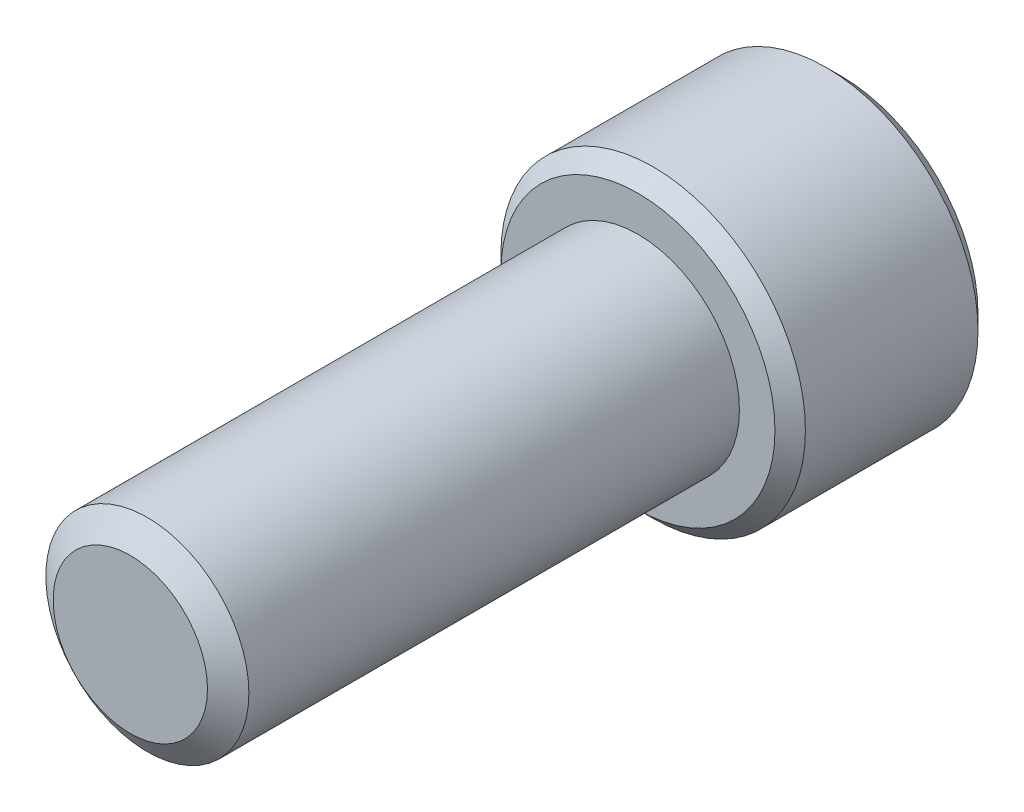
ISO-10303-21;
HEADER;
FILE_DESCRIPTION(('STEP AP214'),'2;1');
FILE_NAME('part.step','',(''),(''),'','','');
FILE_SCHEMA(('AUTOMOTIVE_DESIGN { 1 0 10303 214 1 1 1 1 }'));
ENDSEC;
DATA;
#1=APPLICATION_CONTEXT('core data for automotive mechanical design processes');
#2=APPLICATION_PROTOCOL_DEFINITION('international standard','automotive_design',2000,#1);
#3=PRODUCT_CONTEXT('',#1,'mechanical');
#4=PRODUCT('Part','Part','',(#3));
#5=PRODUCT_RELATED_PRODUCT_CATEGORY('part','',(#4));
#6=PRODUCT_DEFINITION_FORMATION('','',#4);
#7=PRODUCT_DEFINITION_CONTEXT('part definition',#1,'design');
#8=PRODUCT_DEFINITION('design','',#6,#7);
#9=PRODUCT_DEFINITION_SHAPE('','',#8);
#10=(LENGTH_UNIT() NAMED_UNIT(*) SI_UNIT(.MILLI.,.METRE.));
#11=(NAMED_UNIT(*) PLANE_ANGLE_UNIT() SI_UNIT($,.RADIAN.));
#12=(NAMED_UNIT(*) SI_UNIT($,.STERADIAN.) SOLID_ANGLE_UNIT());
#13=UNCERTAINTY_MEASURE_WITH_UNIT(LENGTH_MEASURE(1.E-05),#10,'distance_accuracy_value','');
#14=(GEOMETRIC_REPRESENTATION_CONTEXT(3) GLOBAL_UNCERTAINTY_ASSIGNED_CONTEXT((#13)) GLOBAL_UNIT_ASSIGNED_CONTEXT((#10,
#11,#12)) REPRESENTATION_CONTEXT('',''));
#15=CARTESIAN_POINT('',(0.,0.,0.));
#16=DIRECTION('',(0.,0.,1.));
#17=DIRECTION('',(1.,0.,0.));
#18=AXIS2_PLACEMENT_3D('',#15,#16,#17);
#19=CARTESIAN_POINT('',(0.,0.,-31.75));
#20=DIRECTION('',(0.,0.,1.));
#21=DIRECTION('',(1.,0.,0.));
#22=AXIS2_PLACEMENT_3D('',#19,#20,#21);
#23=CYLINDRICAL_SURFACE('',#22,6.35);
#24=CARTESIAN_POINT('',(0.,0.,-31.75));
#25=DIRECTION('',(0.,0.,-1.));
#26=DIRECTION('',(-1.,0.,0.));
#27=AXIS2_PLACEMENT_3D('',#24,#25,#26);
#28=CIRCLE('',#27,6.35);
#29=CARTESIAN_POINT('',(-6.35,0.,-31.75));
#30=VERTEX_POINT('',#29);
#31=EDGE_CURVE('E211',#30,#30,#28,.F.);
#32=ORIENTED_EDGE('',*,*,#31,.T.);
#33=EDGE_LOOP('',(#32));
#34=FACE_BOUND('',#33,.T.);
#35=CARTESIAN_POINT('',(0.,0.,-1.06645830547519));
#36=DIRECTION('',(0.,0.,1.));
#37=DIRECTION('',(1.,0.,0.));
#38=AXIS2_PLACEMENT_3D('',#35,#36,#37);
#39=CIRCLE('',#38,6.35);
#40=CARTESIAN_POINT('',(6.35,0.,-1.06645830547519));
#41=VERTEX_POINT('',#40);
#42=EDGE_CURVE('E108',#41,#41,#39,.T.);
#43=ORIENTED_EDGE('',*,*,#42,.F.);
#44=EDGE_LOOP('',(#43));
#45=FACE_BOUND('',#44,.T.);
#46=ADVANCED_FACE('F34',(#34,#45),#23,.T.);
#47=CARTESIAN_POINT('',(0.,0.,0.));
#48=DIRECTION('',(0.,0.,-1.));
#49=DIRECTION('',(-1.,0.,0.));
#50=AXIS2_PLACEMENT_3D('',#47,#48,#49);
#51=CONICAL_SURFACE('',#50,4.82693969676203,0.959931088596884);
#52=ORIENTED_EDGE('',*,*,#42,.T.);
#53=EDGE_LOOP('',(#52));
#54=FACE_BOUND('',#53,.T.);
#55=CARTESIAN_POINT('',(0.,0.,0.));
#56=DIRECTION('',(0.,0.,1.));
#57=DIRECTION('',(1.,0.,0.));
#58=AXIS2_PLACEMENT_3D('',#55,#56,#57);
#59=CIRCLE('',#58,4.82693969676203);
#60=CARTESIAN_POINT('',(4.82693969676203,0.,0.));
#61=VERTEX_POINT('',#60);
#62=EDGE_CURVE('E209',#61,#61,#59,.T.);
#63=ORIENTED_EDGE('',*,*,#62,.F.);
#64=EDGE_LOOP('',(#63));
#65=FACE_BOUND('',#64,.T.);
#66=ADVANCED_FACE('F192',(#54,#65),#51,.T.);
#67=CARTESIAN_POINT('',(0.,0.,0.));
#68=DIRECTION('',(0.,0.,1.));
#69=DIRECTION('',(1.,0.,0.));
#70=AXIS2_PLACEMENT_3D('',#67,#68,#69);
#71=PLANE('',#70);
#72=ORIENTED_EDGE('',*,*,#62,.T.);
#73=EDGE_LOOP('',(#72));
#74=FACE_BOUND('',#73,.T.);
#75=ADVANCED_FACE('F189',(#74),#71,.T.);
#76=CARTESIAN_POINT('',(0.,0.,-44.45));
#77=DIRECTION('',(0.,0.,1.));
#78=DIRECTION('',(1.,0.,0.));
#79=AXIS2_PLACEMENT_3D('',#76,#77,#78);
#80=CYLINDRICAL_SURFACE('',#79,9.525);
#81=CARTESIAN_POINT('',(0.,0.,-43.4975));
#82=DIRECTION('',(0.,0.,-1.));
#83=DIRECTION('',(-1.,0.,0.));
#84=AXIS2_PLACEMENT_3D('',#81,#82,#83);
#85=CIRCLE('',#84,9.525);
#86=CARTESIAN_POINT('',(9.525,0.,-43.4975));
#87=VERTEX_POINT('',#86);
#88=EDGE_CURVE('E42',#87,#87,#85,.F.);
#89=CARTESIAN_POINT('',(0.,0.,-32.7025));
#90=DIRECTION('',(0.,0.,-1.));
#91=DIRECTION('',(-1.,0.,0.));
#92=AXIS2_PLACEMENT_3D('',#89,#90,#91);
#93=CIRCLE('',#92,9.525);
#94=CARTESIAN_POINT('',(9.525,0.,-32.7025));
#95=VERTEX_POINT('',#94);
#96=EDGE_CURVE('E168',#95,#95,#93,.T.);
#97=CARTESIAN_POINT('',(9.525,0.,-43.4975));
#98=CARTESIAN_POINT('',(9.525,0.,-43.3850520833333));
#99=CARTESIAN_POINT('',(9.525,0.,-43.2726041666667));
#100=CARTESIAN_POINT('',(9.525,0.,-43.0477083333333));
#101=CARTESIAN_POINT('',(9.525,0.,-42.9352604166667));
#102=CARTESIAN_POINT('',(9.525,0.,-42.7103645833333));
#103=CARTESIAN_POINT('',(9.525,0.,-42.5979166666667));
#104=CARTESIAN_POINT('',(9.525,0.,-42.3730208333333));
#105=CARTESIAN_POINT('',(9.525,0.,-42.2605729166667));
#106=CARTESIAN_POINT('',(9.525,0.,-42.0356770833333));
#107=CARTESIAN_POINT('',(9.525,0.,-41.9232291666667));
#108=CARTESIAN_POINT('',(9.525,0.,-41.6983333333333));
#109=CARTESIAN_POINT('',(9.525,0.,-41.5858854166667));
#110=CARTESIAN_POINT('',(9.525,0.,-41.3609895833333));
#111=CARTESIAN_POINT('',(9.525,0.,-41.2485416666667));
#112=CARTESIAN_POINT('',(9.525,0.,-41.0236458333333));
#113=CARTESIAN_POINT('',(9.525,0.,-40.9111979166667));
#114=CARTESIAN_POINT('',(9.525,0.,-40.6863020833333));
#115=CARTESIAN_POINT('',(9.525,0.,-40.5738541666667));
#116=CARTESIAN_POINT('',(9.525,0.,-40.3489583333333));
#117=CARTESIAN_POINT('',(9.525,0.,-40.2365104166667));
#118=CARTESIAN_POINT('',(9.525,0.,-40.0116145833333));
#119=CARTESIAN_POINT('',(9.525,0.,-39.8991666666667));
#120=CARTESIAN_POINT('',(9.525,0.,-39.6742708333333));
#121=CARTESIAN_POINT('',(9.525,0.,-39.5618229166667));
#122=CARTESIAN_POINT('',(9.525,0.,-39.3369270833333));
#123=CARTESIAN_POINT('',(9.525,0.,-39.2244791666667));
#124=CARTESIAN_POINT('',(9.525,0.,-38.9995833333333));
#125=CARTESIAN_POINT('',(9.525,0.,-38.8871354166667));
#126=CARTESIAN_POINT('',(9.525,0.,-38.6622395833333));
#127=CARTESIAN_POINT('',(9.525,0.,-38.5497916666667));
#128=CARTESIAN_POINT('',(9.525,0.,-38.3248958333333));
#129=CARTESIAN_POINT('',(9.525,0.,-38.2124479166667));
#130=CARTESIAN_POINT('',(9.525,0.,-37.9875520833333));
#131=CARTESIAN_POINT('',(9.525,0.,-37.8751041666667));
#132=CARTESIAN_POINT('',(9.525,0.,-37.6502083333333));
#133=CARTESIAN_POINT('',(9.525,0.,-37.5377604166667));
#134=CARTESIAN_POINT('',(9.525,0.,-37.3128645833333));
#135=CARTESIAN_POINT('',(9.525,0.,-37.2004166666667));
#136=CARTESIAN_POINT('',(9.525,0.,-36.9755208333333));
#137=CARTESIAN_POINT('',(9.525,0.,-36.8630729166667));
#138=CARTESIAN_POINT('',(9.525,0.,-36.6381770833333));
#139=CARTESIAN_POINT('',(9.525,0.,-36.5257291666667));
#140=CARTESIAN_POINT('',(9.525,0.,-36.3008333333333));
#141=CARTESIAN_POINT('',(9.525,0.,-36.1883854166667));
#142=CARTESIAN_POINT('',(9.525,0.,-35.9634895833333));
#143=CARTESIAN_POINT('',(9.525,0.,-35.8510416666667));
#144=CARTESIAN_POINT('',(9.525,0.,-35.6261458333333));
#145=CARTESIAN_POINT('',(9.525,0.,-35.5136979166667));
#146=CARTESIAN_POINT('',(9.525,0.,-35.2888020833333));
#147=CARTESIAN_POINT('',(9.525,0.,-35.1763541666667));
#148=CARTESIAN_POINT('',(9.525,0.,-34.9514583333333));
#149=CARTESIAN_POINT('',(9.525,0.,-34.8390104166667));
#150=CARTESIAN_POINT('',(9.525,0.,-34.6141145833333));
#151=CARTESIAN_POINT('',(9.525,0.,-34.5016666666667));
#152=CARTESIAN_POINT('',(9.525,0.,-34.2767708333333));
#153=CARTESIAN_POINT('',(9.525,0.,-34.1643229166667));
#154=CARTESIAN_POINT('',(9.525,0.,-33.9394270833333));
#155=CARTESIAN_POINT('',(9.525,0.,-33.8269791666667));
#156=CARTESIAN_POINT('',(9.525,0.,-33.6020833333333));
#157=CARTESIAN_POINT('',(9.525,0.,-33.4896354166667));
#158=CARTESIAN_POINT('',(9.525,0.,-33.2647395833333));
#159=CARTESIAN_POINT('',(9.525,0.,-33.1522916666667));
#160=CARTESIAN_POINT('',(9.525,0.,-32.9273958333333));
#161=CARTESIAN_POINT('',(9.525,0.,-32.8149479166667));
#162=CARTESIAN_POINT('',(9.525,0.,-32.7025));
#163=B_SPLINE_CURVE_WITH_KNOTS('',3,(#97,#98,#99,#100,#101,#102,#103,#104,#105,#106,#107,#108,
#109,#110,#111,#112,#113,#114,#115,#116,#117,#118,#119,#120,#121,#122,#123,#124,#125,#126,#127,
#128,#129,#130,#131,#132,#133,#134,#135,#136,#137,#138,#139,#140,#141,#142,#143,#144,#145,#146,
#147,#148,#149,#150,#151,#152,#153,#154,#155,#156,#157,#158,#159,#160,#161,#162),.UNSPECIFIED.,
.F.,.F.,(4,2,2,2,2,2,2,2,2,2,2,2,2,2,2,2,2,2,2,2,2,2,2,2,2,2,2,2,2,2,2,2,4),(0.,
0.337343749999997,0.674687499999993,1.01203125,1.349375,1.68671875,2.02406249999999,2.36140625,
2.69875,3.03609375,3.37343749999999,3.71078125,4.048125,4.38546875,4.72281249999999,5.06015625,
5.3975,5.73484375,6.07218749999999,6.40953125,6.746875,7.08421875,7.42156249999999,7.75890625,
8.09625,8.43359375,8.77093749999999,9.10828125,9.445625,9.78296874999999,10.1203125,10.45765625,
10.795),.UNSPECIFIED.);
#164=EDGE_CURVE('BSEAM173',#87,#95,#163,.T.);
#165=ORIENTED_EDGE('',*,*,#88,.T.);
#166=ORIENTED_EDGE('',*,*,#96,.T.);
#167=ORIENTED_EDGE('',*,*,#164,.T.);
#168=ORIENTED_EDGE('',*,*,#164,.F.);
#169=EDGE_LOOP('',(#165,#167,#166,#168));
#170=FACE_BOUND('',#169,.T.);
#171=ADVANCED_FACE('F173',(#170),#80,.T.);
#172=CARTESIAN_POINT('',(0.,0.,-44.45));
#173=DIRECTION('',(0.,0.,-1.));
#174=DIRECTION('',(-1.,0.,0.));
#175=AXIS2_PLACEMENT_3D('',#172,#173,#174);
#176=PLANE('',#175);
#177=CARTESIAN_POINT('',(0.,0.,-44.45));
#178=DIRECTION('',(0.,0.,-1.));
#179=DIRECTION('',(-1.,0.,0.));
#180=AXIS2_PLACEMENT_3D('',#177,#178,#179);
#181=CIRCLE('',#180,8.5725);
#182=CARTESIAN_POINT('',(8.57250000000001,0.,-44.45));
#183=VERTEX_POINT('',#182);
#184=EDGE_CURVE('E107',#183,#183,#181,.T.);
#185=ORIENTED_EDGE('',*,*,#184,.T.);
#186=EDGE_LOOP('',(#185));
#187=FACE_BOUND('',#186,.T.);
#188=CARTESIAN_POINT('',(0.,0.,-44.45));
#189=DIRECTION('',(0.,0.,-1.));
#190=DIRECTION('',(-1.,0.,0.));
#191=AXIS2_PLACEMENT_3D('',#188,#189,#190);
#192=CIRCLE('',#191,5.49926131403118);
#193=CARTESIAN_POINT('',(-4.7625,2.74963065701559,-44.45));
#194=VERTEX_POINT('',#193);
#195=CARTESIAN_POINT('',(0.,5.49926131403119,-44.45));
#196=VERTEX_POINT('',#195);
#197=EDGE_CURVE('E88',#194,#196,#192,.T.);
#198=ORIENTED_EDGE('',*,*,#197,.F.);
#199=CARTESIAN_POINT('',(-4.7625,-2.74963065701559,-44.45));
#200=VERTEX_POINT('',#199);
#201=EDGE_CURVE('E48',#200,#194,#192,.T.);
#202=ORIENTED_EDGE('',*,*,#201,.F.);
#203=CARTESIAN_POINT('',(0.,-5.49926131403119,-44.45));
#204=VERTEX_POINT('',#203);
#205=EDGE_CURVE('E267',#204,#200,#192,.T.);
#206=ORIENTED_EDGE('',*,*,#205,.F.);
#207=CARTESIAN_POINT('',(4.7625,-2.74963065701559,-44.45));
#208=VERTEX_POINT('',#207);
#209=EDGE_CURVE('E55',#208,#204,#192,.T.);
#210=ORIENTED_EDGE('',*,*,#209,.F.);
#211=CARTESIAN_POINT('',(4.7625,2.7496306570156,-44.45));
#212=VERTEX_POINT('',#211);
#213=EDGE_CURVE('E129',#212,#208,#192,.T.);
#214=ORIENTED_EDGE('',*,*,#213,.F.);
#215=EDGE_CURVE('E97',#196,#212,#192,.T.);
#216=ORIENTED_EDGE('',*,*,#215,.F.);
#217=EDGE_LOOP('',(#198,#202,#206,#210,#214,#216));
#218=FACE_BOUND('',#217,.T.);
#219=ADVANCED_FACE('F128',(#187,#218),#176,.T.);
#220=CARTESIAN_POINT('',(0.,0.,-31.75));
#221=DIRECTION('',(0.,0.,-1.));
#222=DIRECTION('',(-1.,0.,0.));
#223=AXIS2_PLACEMENT_3D('',#220,#221,#222);
#224=PLANE('',#223);
#225=CARTESIAN_POINT('',(0.,0.,-31.75));
#226=DIRECTION('',(0.,0.,-1.));
#227=DIRECTION('',(-1.,0.,0.));
#228=AXIS2_PLACEMENT_3D('',#225,#226,#227);
#229=CIRCLE('',#228,8.5725);
#230=CARTESIAN_POINT('',(-8.5725,0.,-31.75));
#231=VERTEX_POINT('',#230);
#232=EDGE_CURVE('E11',#231,#231,#229,.F.);
#233=ORIENTED_EDGE('',*,*,#232,.T.);
#234=EDGE_LOOP('',(#233));
#235=FACE_BOUND('',#234,.T.);
#236=ORIENTED_EDGE('',*,*,#31,.F.);
#237=EDGE_LOOP('',(#236));
#238=FACE_BOUND('',#237,.T.);
#239=ADVANCED_FACE('F182',(#235,#238),#224,.F.);
#240=CARTESIAN_POINT('',(0.,0.,-44.45));
#241=DIRECTION('',(0.,0.,-1.));
#242=DIRECTION('',(-1.,0.,0.));
#243=AXIS2_PLACEMENT_3D('',#240,#241,#242);
#244=CONICAL_SURFACE('',#243,5.49926131403118,0.78539816339745);
#245=ORIENTED_EDGE('',*,*,#215,.T.);
#246=CARTESIAN_POINT('',(-0.000200000000000345,5.49937678408502,-44.4501154736906));
#247=CARTESIAN_POINT('',(0.0816893480838661,5.45209794692504,-44.4028407556525));
#248=CARTESIAN_POINT('',(0.164208143319191,5.40445569828272,-44.3570168014971));
#249=CARTESIAN_POINT('',(0.330628122507659,5.30837307849973,-44.2687117475931));
#250=CARTESIAN_POINT('',(0.414530031662503,5.25993228866365,-44.2262324736266));
#251=CARTESIAN_POINT('',(0.669275181013717,5.11285510811098,-44.1041113956322));
#252=CARTESIAN_POINT('',(0.842275000393996,5.01297361582202,-44.0303073349844));
#253=CARTESIAN_POINT('',(1.1911430001273,4.81155458226435,-43.9039228471471));
#254=CARTESIAN_POINT('',(1.36692200675387,4.71006852547062,-43.8510240046038));
#255=CARTESIAN_POINT('',(1.63348047384544,4.55617092274053,-43.7898329527378));
#256=CARTESIAN_POINT('',(1.722725751811,4.5046451374832,-43.7724703211731));
#257=CARTESIAN_POINT('',(1.90197198308188,4.40115727760774,-43.744190373215));
#258=CARTESIAN_POINT('',(1.99197282140491,4.34919526937464,-43.7332720935183));
#259=CARTESIAN_POINT('',(2.21129017337659,4.22257233717584,-43.714966175378));
#260=CARTESIAN_POINT('',(2.34084298819892,4.14777498466389,-43.7111250872346));
#261=CARTESIAN_POINT('',(2.59971514322133,3.998315076276,-43.71757107705));
#262=CARTESIAN_POINT('',(2.7290343856686,3.92365257683768,-43.7278631075927));
#263=CARTESIAN_POINT('',(2.98645369702303,3.77503146813259,-43.7619686587254));
#264=CARTESIAN_POINT('',(3.11455223924902,3.70107374029561,-43.7857973014266));
#265=CARTESIAN_POINT('',(3.36854763194612,3.55442943194902,-43.8456805959169));
#266=CARTESIAN_POINT('',(3.49444465045488,3.48174275442281,-43.881734310271));
#267=CARTESIAN_POINT('',(3.71793882917551,3.35270833017614,-43.9559094233337));
#268=CARTESIAN_POINT('',(3.8160307872892,3.29607491175387,-43.9920803606544));
#269=CARTESIAN_POINT('',(4.01045375934658,3.18382475649989,-44.0702513094624));
#270=CARTESIAN_POINT('',(4.10678471969659,3.12820805061052,-44.1122514980222));
#271=CARTESIAN_POINT('',(4.29738229488755,3.01816648926713,-44.2011393953942));
#272=CARTESIAN_POINT('',(4.39165433052154,2.96373850411679,-44.2480117345331));
#273=CARTESIAN_POINT('',(4.57845266367266,2.85589043618782,-44.3460284938486));
#274=CARTESIAN_POINT('',(4.67097998993277,2.80246975946415,-44.397170293478));
#275=CARTESIAN_POINT('',(4.7627,2.74951518696176,-44.4501154736906));
#276=B_SPLINE_CURVE_WITH_KNOTS('',3,(#246,#247,#248,#249,#250,#251,#252,#253,#254,#255,#256,
#257,#258,#259,#260,#261,#262,#263,#264,#265,#266,#267,#268,#269,#270,#271,#272,#273,#274,#275),
.UNSPECIFIED.,.F.,.F.,(4,2,2,2,2,2,2,2,2,2,2,2,2,2,4),(0.,0.317131998246114,0.63443592816495,
1.27246967840819,1.90037160310751,2.21370673072325,2.52699500906332,2.97522950661222,
3.42362111637256,3.87251462420204,4.32137371805213,4.67791268795819,5.03446249066165,
5.38991982411499,5.7451605637036),.UNSPECIFIED.);
#277=EDGE_CURVE('E102',#196,#212,#276,.T.);
#278=ORIENTED_EDGE('',*,*,#277,.F.);
#279=EDGE_LOOP('',(#245,#278));
#280=FACE_BOUND('',#279,.T.);
#281=ADVANCED_FACE('F103',(#280),#244,.F.);
#282=ORIENTED_EDGE('',*,*,#213,.T.);
#283=CARTESIAN_POINT('',(4.7625,-5.48388581178774,-46.2139617891598));
#284=CARTESIAN_POINT('',(4.7625,-5.35035922109852,-46.1131693359319));
#285=CARTESIAN_POINT('',(4.7625,-5.21608502224391,-46.0133511751692));
#286=CARTESIAN_POINT('',(4.7625,-4.94574650111728,-45.8160996619835));
#287=CARTESIAN_POINT('',(4.7625,-4.80968173792853,-45.718666914514));
#288=CARTESIAN_POINT('',(4.7625,-4.53447187008637,-45.5259297088824));
#289=CARTESIAN_POINT('',(4.7625,-4.39531106684215,-45.4306475907792));
#290=CARTESIAN_POINT('',(4.7625,-4.1146273569229,-45.2436398468593));
#291=CARTESIAN_POINT('',(4.7625,-3.97310461814435,-45.151913969777));
#292=CARTESIAN_POINT('',(4.7625,-3.67915365943653,-44.9676909372029));
#293=CARTESIAN_POINT('',(4.7625,-3.52656445385329,-44.8754493500526));
#294=CARTESIAN_POINT('',(4.7625,-3.21782430493592,-44.6970350361653));
#295=CARTESIAN_POINT('',(4.7625,-3.06167280246542,-44.6108632709426));
#296=CARTESIAN_POINT('',(4.7625,-2.74582258478881,-44.4464478893172));
#297=CARTESIAN_POINT('',(4.7625,-2.58613610080726,-44.3681809601197));
#298=CARTESIAN_POINT('',(4.7625,-2.26240805689586,-44.2213273547376));
#299=CARTESIAN_POINT('',(4.7625,-2.09836850912671,-44.1527362954894));
#300=CARTESIAN_POINT('',(4.7625,-1.77907051581844,-44.0327092630561));
#301=CARTESIAN_POINT('',(4.7625,-1.62416773376041,-43.9803369574484));
#302=CARTESIAN_POINT('',(4.7625,-1.31063273083529,-43.8880195023893));
#303=CARTESIAN_POINT('',(4.7625,-1.15200025385341,-43.848075209055));
#304=CARTESIAN_POINT('',(4.7625,-0.834591529608672,-43.7833642925721));
#305=CARTESIAN_POINT('',(4.7625,-0.675869177242026,-43.7583376243693));
#306=CARTESIAN_POINT('',(4.7625,-0.356727682468881,-43.7239477126733));
#307=CARTESIAN_POINT('',(4.7625,-0.196308836510142,-43.7145817766674));
#308=CARTESIAN_POINT('',(4.7625,0.118837522614849,-43.7122089092024));
#309=CARTESIAN_POINT('',(4.7625,0.273560867955293,-43.7186221219989));
#310=CARTESIAN_POINT('',(4.7625,0.581682230341388,-43.7461740124862));
#311=CARTESIAN_POINT('',(4.7625,0.735080117171964,-43.767314120686));
#312=CARTESIAN_POINT('',(4.7625,1.04203381322605,-43.8235260427747));
#313=CARTESIAN_POINT('',(4.7625,1.19554550604675,-43.8588349389728));
#314=CARTESIAN_POINT('',(4.7625,1.49922403888639,-43.9415013514975));
#315=CARTESIAN_POINT('',(4.7625,1.64939115763907,-43.98885785967));
#316=CARTESIAN_POINT('',(4.7625,1.95997972064102,-44.0985417757163));
#317=CARTESIAN_POINT('',(4.7625,2.1200498294441,-44.161854037463));
#318=CARTESIAN_POINT('',(4.7625,2.43603219749264,-44.2981984477104));
#319=CARTESIAN_POINT('',(4.7625,2.59194247896613,-44.3712351241623));
#320=CARTESIAN_POINT('',(4.7625,2.90036713506396,-44.5252906655538));
#321=CARTESIAN_POINT('',(4.7625,3.05286888920128,-44.6063345937996));
#322=CARTESIAN_POINT('',(4.7625,3.3543629348118,-44.7746133515017));
#323=CARTESIAN_POINT('',(4.7625,3.50335577943939,-44.8618471963426));
#324=CARTESIAN_POINT('',(4.7625,3.79095963433685,-45.0368226733915));
#325=CARTESIAN_POINT('',(4.7625,3.92971827501105,-45.1243229288265));
#326=CARTESIAN_POINT('',(4.7625,4.20485340546187,-45.3030029741682));
#327=CARTESIAN_POINT('',(4.7625,4.34122971367904,-45.3941830427787));
#328=CARTESIAN_POINT('',(4.7625,4.61080608732201,-45.5788118247346));
#329=CARTESIAN_POINT('',(4.7625,4.7440229549486,-45.6722360930792));
#330=CARTESIAN_POINT('',(4.7625,5.00863613054828,-45.8615552487242));
#331=CARTESIAN_POINT('',(4.7625,5.14003292909845,-45.9574494495425));
#332=CARTESIAN_POINT('',(4.7625,5.27066757711893,-46.054353467085));
#333=B_SPLINE_CURVE_WITH_KNOTS('',3,(#283,#284,#285,#286,#287,#288,#289,#290,#291,#292,#293,
#294,#295,#296,#297,#298,#299,#300,#301,#302,#303,#304,#305,#306,#307,#308,#309,#310,#311,#312,
#313,#314,#315,#316,#317,#318,#319,#320,#321,#322,#323,#324,#325,#326,#327,#328,#329,#330,#331,
#332),.UNSPECIFIED.,.F.,.F.,(4,2,2,2,2,2,2,2,2,2,2,2,2,2,2,2,2,2,2,2,2,2,2,2,4),(0.,
0.501902568019972,1.00393112965577,1.50984955194718,2.01573216329084,2.55052903608619,
3.08541043586616,3.61866524806543,4.15167772057686,4.64179705613575,5.13195014661719,
5.61328801048044,6.09454311055177,6.55837882375549,7.02225959830171,7.49424955247613,
7.96620002312871,8.48220672640918,8.99845454218858,9.51637278206305,10.0342088217976,
10.5262709591158,11.018370434702,11.5064725267514,11.994440391368),.UNSPECIFIED.);
#334=EDGE_CURVE('E96',#212,#208,#333,.F.);
#335=ORIENTED_EDGE('',*,*,#334,.F.);
#336=EDGE_LOOP('',(#282,#335));
#337=FACE_BOUND('',#336,.T.);
#338=ADVANCED_FACE('F273',(#337),#244,.F.);
#339=ORIENTED_EDGE('',*,*,#209,.T.);
#340=CARTESIAN_POINT('',(4.7627,-2.74951518696176,-44.4501154736906));
#341=CARTESIAN_POINT('',(4.68081065191613,-2.79679402412174,-44.4028407556525));
#342=CARTESIAN_POINT('',(4.59829185668081,-2.84443627276406,-44.3570168014971));
#343=CARTESIAN_POINT('',(4.43187187749234,-2.94051889254705,-44.2687117475931));
#344=CARTESIAN_POINT('',(4.3479699683375,-2.98895968238312,-44.2262324736266));
#345=CARTESIAN_POINT('',(4.09322481898628,-3.1360368629358,-44.1041113956322));
#346=CARTESIAN_POINT('',(3.920224999606,-3.23591835522476,-44.0303073349843));
#347=CARTESIAN_POINT('',(3.5713569998727,-3.43733738878243,-43.9039228471471));
#348=CARTESIAN_POINT('',(3.39557799324613,-3.53882344557616,-43.8510240046038));
#349=CARTESIAN_POINT('',(3.12901952615456,-3.69272104830625,-43.7898329527378));
#350=CARTESIAN_POINT('',(3.039774248189,-3.74424683356358,-43.7724703211731));
#351=CARTESIAN_POINT('',(2.86052801691812,-3.84773469343904,-43.744190373215));
#352=CARTESIAN_POINT('',(2.77052717859509,-3.89969670167213,-43.7332720935183));
#353=CARTESIAN_POINT('',(2.55120982662341,-4.02631963387094,-43.714966175378));
#354=CARTESIAN_POINT('',(2.42165701180108,-4.10111698638289,-43.7111250872346));
#355=CARTESIAN_POINT('',(2.16278485677867,-4.25057689477078,-43.71757107705));
#356=CARTESIAN_POINT('',(2.0334656143314,-4.3252393942091,-43.7278631075927));
#357=CARTESIAN_POINT('',(1.77604630297697,-4.47386050291419,-43.7619686587254));
#358=CARTESIAN_POINT('',(1.64794776075098,-4.54781823075117,-43.7857973014266));
#359=CARTESIAN_POINT('',(1.39395236805388,-4.69446253909776,-43.8456805959169));
#360=CARTESIAN_POINT('',(1.26805534954512,-4.76714921662397,-43.881734310271));
#361=CARTESIAN_POINT('',(1.04456117082449,-4.89618364087063,-43.9559094233337));
#362=CARTESIAN_POINT('',(0.946469212710801,-4.95281705929291,-43.9920803606544));
#363=CARTESIAN_POINT('',(0.75204624065342,-5.06506721454689,-44.0702513094624));
#364=CARTESIAN_POINT('',(0.655715280303414,-5.12068392043626,-44.1122514980222));
#365=CARTESIAN_POINT('',(0.465117705112458,-5.23072548177965,-44.2011393953942));
#366=CARTESIAN_POINT('',(0.370845669478464,-5.28515346692999,-44.2480117345331));
#367=CARTESIAN_POINT('',(0.184047336327343,-5.39300153485896,-44.3460284938486));
#368=CARTESIAN_POINT('',(0.0915200100672353,-5.44642221158263,-44.397170293478));
#369=CARTESIAN_POINT('',(-0.000200000000000106,-5.49937678408502,-44.4501154736906));
#370=B_SPLINE_CURVE_WITH_KNOTS('',3,(#340,#341,#342,#343,#344,#345,#346,#347,#348,#349,#350,
#351,#352,#353,#354,#355,#356,#357,#358,#359,#360,#361,#362,#363,#364,#365,#366,#367,#368,#369),
.UNSPECIFIED.,.F.,.F.,(4,2,2,2,2,2,2,2,2,2,2,2,2,2,4),(0.,0.317131998246114,0.63443592816495,
1.27246967840819,1.90037160310751,2.21370673072325,2.52699500906332,2.97522950661222,
3.42362111637256,3.87251462420204,4.32137371805213,4.67791268795819,5.03446249066165,
5.38991982411499,5.7451605637036),.UNSPECIFIED.);
#371=EDGE_CURVE('E138',#208,#204,#370,.T.);
#372=ORIENTED_EDGE('',*,*,#371,.F.);
#373=EDGE_LOOP('',(#339,#372));
#374=FACE_BOUND('',#373,.T.);
#375=ADVANCED_FACE('F270',(#374),#244,.F.);
#376=ORIENTED_EDGE('',*,*,#205,.T.);
#377=CARTESIAN_POINT('',(0.000200000000001687,-5.49937678408502,-44.4501154736906));
#378=CARTESIAN_POINT('',(-0.0816893480838646,-5.45209794692504,-44.4028407556525));
#379=CARTESIAN_POINT('',(-0.16420814331919,-5.40445569828272,-44.3570168014971));
#380=CARTESIAN_POINT('',(-0.330628122507658,-5.30837307849973,-44.2687117475931));
#381=CARTESIAN_POINT('',(-0.414530031662502,-5.25993228866365,-44.2262324736266));
#382=CARTESIAN_POINT('',(-0.669275181013716,-5.11285510811098,-44.1041113956322));
#383=CARTESIAN_POINT('',(-0.842275000393996,-5.01297361582202,-44.0303073349844));
#384=CARTESIAN_POINT('',(-1.1911430001273,-4.81155458226435,-43.9039228471471));
#385=CARTESIAN_POINT('',(-1.36692200675387,-4.71006852547061,-43.8510240046038));
#386=CARTESIAN_POINT('',(-1.63348047384544,-4.55617092274052,-43.7898329527378));
#387=CARTESIAN_POINT('',(-1.722725751811,-4.5046451374832,-43.7724703211731));
#388=CARTESIAN_POINT('',(-1.90197198308188,-4.40115727760774,-43.744190373215));
#389=CARTESIAN_POINT('',(-1.99197282140491,-4.34919526937464,-43.7332720935183));
#390=CARTESIAN_POINT('',(-2.21129017337659,-4.22257233717584,-43.714966175378));
#391=CARTESIAN_POINT('',(-2.34084298819893,-4.14777498466389,-43.7111250872346));
#392=CARTESIAN_POINT('',(-2.59971514322134,-3.998315076276,-43.71757107705));
#393=CARTESIAN_POINT('',(-2.7290343856686,-3.92365257683767,-43.7278631075927));
#394=CARTESIAN_POINT('',(-2.98645369702303,-3.77503146813259,-43.7619686587254));
#395=CARTESIAN_POINT('',(-3.11455223924902,-3.70107374029561,-43.7857973014266));
#396=CARTESIAN_POINT('',(-3.36854763194612,-3.55442943194901,-43.8456805959169));
#397=CARTESIAN_POINT('',(-3.49444465045489,-3.48174275442281,-43.881734310271));
#398=CARTESIAN_POINT('',(-3.71793882917551,-3.35270833017614,-43.9559094233337));
#399=CARTESIAN_POINT('',(-3.8160307872892,-3.29607491175387,-43.9920803606544));
#400=CARTESIAN_POINT('',(-4.01045375934658,-3.18382475649989,-44.0702513094624));
#401=CARTESIAN_POINT('',(-4.10678471969659,-3.12820805061052,-44.1122514980222));
#402=CARTESIAN_POINT('',(-4.29738229488755,-3.01816648926713,-44.2011393953942));
#403=CARTESIAN_POINT('',(-4.39165433052154,-2.96373850411679,-44.2480117345331));
#404=CARTESIAN_POINT('',(-4.57845266367266,-2.85589043618782,-44.3460284938486));
#405=CARTESIAN_POINT('',(-4.67097998993277,-2.80246975946415,-44.397170293478));
#406=CARTESIAN_POINT('',(-4.7627,-2.74951518696175,-44.4501154736906));
#407=B_SPLINE_CURVE_WITH_KNOTS('',3,(#377,#378,#379,#380,#381,#382,#383,#384,#385,#386,#387,
#388,#389,#390,#391,#392,#393,#394,#395,#396,#397,#398,#399,#400,#401,#402,#403,#404,#405,#406),
.UNSPECIFIED.,.F.,.F.,(4,2,2,2,2,2,2,2,2,2,2,2,2,2,4),(0.,0.317131998246114,0.634435928164951,
1.27246967840819,1.90037160310751,2.21370673072325,2.52699500906333,2.97522950661223,
3.42362111637257,3.87251462420205,4.32137371805213,4.67791268795819,5.03446249066166,
5.38991982411499,5.7451605637036),.UNSPECIFIED.);
#408=EDGE_CURVE('E245',#204,#200,#407,.T.);
#409=ORIENTED_EDGE('',*,*,#408,.F.);
#410=EDGE_LOOP('',(#376,#409));
#411=FACE_BOUND('',#410,.T.);
#412=ADVANCED_FACE('F269',(#411),#244,.F.);
#413=ORIENTED_EDGE('',*,*,#201,.T.);
#414=CARTESIAN_POINT('',(-4.7625,-5.48388581258561,-46.2139617897622));
#415=CARTESIAN_POINT('',(-4.7625,-5.35035922187402,-46.1131693365111));
#416=CARTESIAN_POINT('',(-4.7625,-5.21608502299695,-46.0133511757253));
#417=CARTESIAN_POINT('',(-4.7625,-4.94574650182517,-45.8160996624934));
#418=CARTESIAN_POINT('',(-4.7625,-4.80968173861374,-45.7186669150008));
#419=CARTESIAN_POINT('',(-4.7625,-4.53447187072545,-45.525929709323));
#420=CARTESIAN_POINT('',(-4.7625,-4.39531106745777,-45.4306475911966));
#421=CARTESIAN_POINT('',(-4.7625,-4.11462735749119,-45.2436398472307));
#422=CARTESIAN_POINT('',(-4.7625,-3.97310461868876,-45.1519139701256));
#423=CARTESIAN_POINT('',(-4.7625,-3.67915365992945,-44.967690937504));
#424=CARTESIAN_POINT('',(-4.7625,-3.52656445431853,-44.8754493503292));
#425=CARTESIAN_POINT('',(-4.7625,-3.2178243053448,-44.6970350363939));
#426=CARTESIAN_POINT('',(-4.7625,-3.06167280284561,-44.6108632711477));
#427=CARTESIAN_POINT('',(-4.7625,-2.74582258511061,-44.4464478894775));
#428=CARTESIAN_POINT('',(-4.7625,-2.58613610109936,-44.3681809602585));
#429=CARTESIAN_POINT('',(-4.7625,-2.26240805712696,-44.2213273548362));
#430=CARTESIAN_POINT('',(-4.7625,-2.09836850932652,-44.1527362955692));
#431=CARTESIAN_POINT('',(-4.7625,-1.77907051600474,-44.0327092631219));
#432=CARTESIAN_POINT('',(-4.7625,-1.62416773396585,-43.9803369575153));
#433=CARTESIAN_POINT('',(-4.7625,-1.31063273107964,-43.8880195024548));
#434=CARTESIAN_POINT('',(-4.7625,-1.15200025411753,-43.8480752091178));
#435=CARTESIAN_POINT('',(-4.7625,-0.834591529911674,-43.7833642926251));
#436=CARTESIAN_POINT('',(-4.7625,-0.675869177564134,-43.7583376244153));
#437=CARTESIAN_POINT('',(-4.7625,-0.356727682828562,-43.7239477127008));
#438=CARTESIAN_POINT('',(-4.7625,-0.196308836888289,-43.7145817766835));
#439=CARTESIAN_POINT('',(-4.7625,0.118837522202628,-43.7122089091926));
#440=CARTESIAN_POINT('',(-4.7625,0.273560867527419,-43.7186221219748));
#441=CARTESIAN_POINT('',(-4.7625,0.581682229883773,-43.7461740124311));
#442=CARTESIAN_POINT('',(-4.7625,0.735080116700263,-43.7673141206143));
#443=CARTESIAN_POINT('',(-4.7625,1.04203381272654,-43.8235260426682));
#444=CARTESIAN_POINT('',(-4.7625,1.19554550553356,-43.858834938848));
#445=CARTESIAN_POINT('',(-4.7625,1.49922403834716,-43.9415013513357));
#446=CARTESIAN_POINT('',(-4.7625,1.64939115708748,-43.9888578594896));
#447=CARTESIAN_POINT('',(-4.7625,1.95997972002342,-44.0985417754825));
#448=CARTESIAN_POINT('',(-4.7625,2.12004982877402,-44.1618540371914));
#449=CARTESIAN_POINT('',(-4.7625,2.43603219672028,-44.2981984473595));
#450=CARTESIAN_POINT('',(-4.7625,2.59194247814397,-44.37123512377));
#451=CARTESIAN_POINT('',(-4.7625,2.900367134144,-44.5252906650759));
#452=CARTESIAN_POINT('',(-4.7625,3.05286888823332,-44.6063345932777));
#453=CARTESIAN_POINT('',(-4.7625,3.3543629337494,-44.7746133508903));
#454=CARTESIAN_POINT('',(-4.7625,3.50335577833056,-44.8618471956859));
#455=CARTESIAN_POINT('',(-4.7625,3.79095963314362,-45.0368226726486));
#456=CARTESIAN_POINT('',(-4.7625,3.92971827377971,-45.1243229280429));
#457=CARTESIAN_POINT('',(-4.7625,4.20485340415483,-45.3030029733033));
#458=CARTESIAN_POINT('',(-4.7625,4.34122971233443,-45.394183041873));
#459=CARTESIAN_POINT('',(-4.7625,4.61080608590315,-45.5788118237478));
#460=CARTESIAN_POINT('',(-4.7625,4.74402295349307,-45.6722360920521));
#461=CARTESIAN_POINT('',(-4.7625,5.00863612901964,-45.8615552476165));
#462=CARTESIAN_POINT('',(-4.7625,5.14003292753338,-45.9574494483944));
#463=CARTESIAN_POINT('',(-4.7625,5.27066757551748,-46.0543534658968));
#464=B_SPLINE_CURVE_WITH_KNOTS('',3,(#414,#415,#416,#417,#418,#419,#420,#421,#422,#423,#424,
#425,#426,#427,#428,#429,#430,#431,#432,#433,#434,#435,#436,#437,#438,#439,#440,#441,#442,#443,
#444,#445,#446,#447,#448,#449,#450,#451,#452,#453,#454,#455,#456,#457,#458,#459,#460,#461,#462,
#463),.UNSPECIFIED.,.F.,.F.,(4,2,2,2,2,2,2,2,2,2,2,2,2,2,2,2,2,2,2,2,2,2,2,2,4),(0.,
0.501902568115502,1.00393112984686,1.50984955223563,2.01573216367663,2.55052903658114,
3.08541043647034,3.61866524877791,4.15167772139747,4.64179705690101,5.1319501473272,
5.61328801113744,6.09454311115577,6.55837882431099,7.02225959880865,7.4942495529308,
7.96620002353113,8.4822067266238,8.99845454221519,9.51637278190056,10.0342088214461,
10.5262709586026,11.0183704340271,11.506472525917,11.994440390374),.UNSPECIFIED.);
#465=EDGE_CURVE('E118',#200,#194,#464,.T.);
#466=ORIENTED_EDGE('',*,*,#465,.F.);
#467=EDGE_LOOP('',(#413,#466));
#468=FACE_BOUND('',#467,.T.);
#469=ADVANCED_FACE('F282',(#468),#244,.F.);
#470=ORIENTED_EDGE('',*,*,#197,.T.);
#471=CARTESIAN_POINT('',(-4.7627,2.74951518696176,-44.4501154736906));
#472=CARTESIAN_POINT('',(-4.68081065191613,2.79679402412174,-44.4028407556525));
#473=CARTESIAN_POINT('',(-4.59829185668081,2.84443627276406,-44.3570168014971));
#474=CARTESIAN_POINT('',(-4.43187187749234,2.94051889254705,-44.2687117475931));
#475=CARTESIAN_POINT('',(-4.34796996833749,2.98895968238312,-44.2262324736266));
#476=CARTESIAN_POINT('',(-4.09322481898628,3.1360368629358,-44.1041113956322));
#477=CARTESIAN_POINT('',(-3.920224999606,3.23591835522476,-44.0303073349844));
#478=CARTESIAN_POINT('',(-3.5713569998727,3.43733738878243,-43.9039228471471));
#479=CARTESIAN_POINT('',(-3.39557799324613,3.53882344557616,-43.8510240046038));
#480=CARTESIAN_POINT('',(-3.12901952615456,3.69272104830625,-43.7898329527378));
#481=CARTESIAN_POINT('',(-3.039774248189,3.74424683356358,-43.7724703211731));
#482=CARTESIAN_POINT('',(-2.86052801691812,3.84773469343904,-43.744190373215));
#483=CARTESIAN_POINT('',(-2.77052717859509,3.89969670167214,-43.7332720935183));
#484=CARTESIAN_POINT('',(-2.55120982662341,4.02631963387094,-43.714966175378));
#485=CARTESIAN_POINT('',(-2.42165701180107,4.10111698638289,-43.7111250872346));
#486=CARTESIAN_POINT('',(-2.16278485677866,4.25057689477078,-43.71757107705));
#487=CARTESIAN_POINT('',(-2.0334656143314,4.3252393942091,-43.7278631075927));
#488=CARTESIAN_POINT('',(-1.77604630297697,4.47386050291419,-43.7619686587254));
#489=CARTESIAN_POINT('',(-1.64794776075098,4.54781823075117,-43.7857973014266));
#490=CARTESIAN_POINT('',(-1.39395236805387,4.69446253909776,-43.8456805959169));
#491=CARTESIAN_POINT('',(-1.26805534954511,4.76714921662397,-43.881734310271));
#492=CARTESIAN_POINT('',(-1.04456117082449,4.89618364087064,-43.9559094233337));
#493=CARTESIAN_POINT('',(-0.946469212710797,4.95281705929291,-43.9920803606544));
#494=CARTESIAN_POINT('',(-0.752046240653417,5.06506721454689,-44.0702513094624));
#495=CARTESIAN_POINT('',(-0.655715280303412,5.12068392043626,-44.1122514980222));
#496=CARTESIAN_POINT('',(-0.465117705112455,5.23072548177965,-44.2011393953942));
#497=CARTESIAN_POINT('',(-0.370845669478461,5.28515346692999,-44.2480117345331));
#498=CARTESIAN_POINT('',(-0.184047336327339,5.39300153485896,-44.3460284938486));
#499=CARTESIAN_POINT('',(-0.0915200100672303,5.44642221158263,-44.397170293478));
#500=CARTESIAN_POINT('',(0.000200000000002468,5.49937678408502,-44.4501154736906));
#501=B_SPLINE_CURVE_WITH_KNOTS('',3,(#471,#472,#473,#474,#475,#476,#477,#478,#479,#480,#481,
#482,#483,#484,#485,#486,#487,#488,#489,#490,#491,#492,#493,#494,#495,#496,#497,#498,#499,#500),
.UNSPECIFIED.,.F.,.F.,(4,2,2,2,2,2,2,2,2,2,2,2,2,2,4),(0.,0.317131998246115,0.634435928164952,
1.27246967840819,1.90037160310751,2.21370673072325,2.52699500906333,2.97522950661223,
3.42362111637257,3.87251462420205,4.32137371805213,4.67791268795819,5.03446249066165,
5.38991982411499,5.7451605637036),.UNSPECIFIED.);
#502=EDGE_CURVE('E92',#194,#196,#501,.T.);
#503=ORIENTED_EDGE('',*,*,#502,.F.);
#504=EDGE_LOOP('',(#470,#503));
#505=FACE_BOUND('',#504,.T.);
#506=ADVANCED_FACE('F90',(#505),#244,.F.);
#507=CARTESIAN_POINT('',(4.7625,8.24889197104678,-37.30625));
#508=DIRECTION('',(0.,0.,-1.));
#509=DIRECTION('',(-1.,0.,0.));
#510=AXIS2_PLACEMENT_3D('',#507,#508,#509);
#511=PLANE('',#510);
#512=DIRECTION('',(0.866025403784439,0.5,0.));
#513=VECTOR('',#512,1.);
#514=CARTESIAN_POINT('',(-4.7625,2.74963065701559,-37.30625));
#515=LINE('',#514,#513);
#516=CARTESIAN_POINT('',(-4.7625,2.74963065701559,-37.30625));
#517=VERTEX_POINT('',#516);
#518=CARTESIAN_POINT('',(0.,5.49926131403118,-37.30625));
#519=VERTEX_POINT('',#518);
#520=EDGE_CURVE('E117',#517,#519,#515,.T.);
#521=ORIENTED_EDGE('',*,*,#520,.T.);
#522=DIRECTION('',(0.866025403784439,-0.5,0.));
#523=VECTOR('',#522,1.);
#524=CARTESIAN_POINT('',(0.,5.49926131403118,-37.30625));
#525=LINE('',#524,#523);
#526=CARTESIAN_POINT('',(4.7625,2.74963065701559,-37.30625));
#527=VERTEX_POINT('',#526);
#528=EDGE_CURVE('E122',#519,#527,#525,.T.);
#529=ORIENTED_EDGE('',*,*,#528,.T.);
#530=DIRECTION('',(0.,-1.,0.));
#531=VECTOR('',#530,1.);
#532=CARTESIAN_POINT('',(4.7625,2.74963065701559,-37.30625));
#533=LINE('',#532,#531);
#534=CARTESIAN_POINT('',(4.7625,-2.74963065701559,-37.30625));
#535=VERTEX_POINT('',#534);
#536=EDGE_CURVE('E233',#527,#535,#533,.T.);
#537=ORIENTED_EDGE('',*,*,#536,.T.);
#538=DIRECTION('',(-0.866025403784439,-0.5,0.));
#539=VECTOR('',#538,1.);
#540=CARTESIAN_POINT('',(4.7625,-2.74963065701559,-37.30625));
#541=LINE('',#540,#539);
#542=CARTESIAN_POINT('',(0.,-5.49926131403119,-37.30625));
#543=VERTEX_POINT('',#542);
#544=EDGE_CURVE('E230',#535,#543,#541,.T.);
#545=ORIENTED_EDGE('',*,*,#544,.T.);
#546=DIRECTION('',(-0.866025403784439,0.5,0.));
#547=VECTOR('',#546,1.);
#548=CARTESIAN_POINT('',(0.,-5.49926131403119,-37.30625));
#549=LINE('',#548,#547);
#550=CARTESIAN_POINT('',(-4.7625,-2.74963065701559,-37.30625));
#551=VERTEX_POINT('',#550);
#552=EDGE_CURVE('E227',#543,#551,#549,.T.);
#553=ORIENTED_EDGE('',*,*,#552,.T.);
#554=DIRECTION('',(0.,1.,0.));
#555=VECTOR('',#554,1.);
#556=CARTESIAN_POINT('',(-4.7625,-2.74963065701559,-37.30625));
#557=LINE('',#556,#555);
#558=EDGE_CURVE('E125',#551,#517,#557,.T.);
#559=ORIENTED_EDGE('',*,*,#558,.T.);
#560=EDGE_LOOP('',(#521,#529,#537,#545,#553,#559));
#561=FACE_BOUND('',#560,.T.);
#562=ADVANCED_FACE('F157',(#561),#511,.T.);
#563=CARTESIAN_POINT('',(0.,5.49926131403118,-37.30625));
#564=DIRECTION('',(0.5,0.866025403784439,0.));
#565=DIRECTION('',(-0.866025403784439,0.5,0.));
#566=AXIS2_PLACEMENT_3D('',#563,#564,#565);
#567=PLANE('',#566);
#568=DIRECTION('',(0.,0.,-1.));
#569=VECTOR('',#568,1.);
#570=CARTESIAN_POINT('',(0.,5.49926131403118,-37.30625));
#571=LINE('',#570,#569);
#572=EDGE_CURVE('E114',#519,#196,#571,.T.);
#573=ORIENTED_EDGE('',*,*,#572,.T.);
#574=ORIENTED_EDGE('',*,*,#277,.T.);
#575=DIRECTION('',(0.,0.,-1.));
#576=VECTOR('',#575,1.);
#577=CARTESIAN_POINT('',(4.7625,2.74963065701559,-37.30625));
#578=LINE('',#577,#576);
#579=EDGE_CURVE('E124',#527,#212,#578,.T.);
#580=ORIENTED_EDGE('',*,*,#579,.F.);
#581=ORIENTED_EDGE('',*,*,#528,.F.);
#582=EDGE_LOOP('',(#573,#574,#580,#581));
#583=FACE_BOUND('',#582,.T.);
#584=ADVANCED_FACE('F120',(#583),#567,.F.);
#585=CARTESIAN_POINT('',(4.7625,2.74963065701559,-37.30625));
#586=DIRECTION('',(1.,0.,0.));
#587=DIRECTION('',(0.,1.,0.));
#588=AXIS2_PLACEMENT_3D('',#585,#586,#587);
#589=PLANE('',#588);
#590=ORIENTED_EDGE('',*,*,#579,.T.);
#591=ORIENTED_EDGE('',*,*,#334,.T.);
#592=DIRECTION('',(0.,0.,-1.));
#593=VECTOR('',#592,1.);
#594=CARTESIAN_POINT('',(4.7625,-2.74963065701559,-37.30625));
#595=LINE('',#594,#593);
#596=EDGE_CURVE('E216',#535,#208,#595,.T.);
#597=ORIENTED_EDGE('',*,*,#596,.F.);
#598=ORIENTED_EDGE('',*,*,#536,.F.);
#599=EDGE_LOOP('',(#590,#591,#597,#598));
#600=FACE_BOUND('',#599,.T.);
#601=ADVANCED_FACE('F146',(#600),#589,.F.);
#602=CARTESIAN_POINT('',(4.7625,-2.74963065701559,-37.30625));
#603=DIRECTION('',(0.5,-0.866025403784439,0.));
#604=DIRECTION('',(0.866025403784439,0.5,0.));
#605=AXIS2_PLACEMENT_3D('',#602,#603,#604);
#606=PLANE('',#605);
#607=ORIENTED_EDGE('',*,*,#596,.T.);
#608=ORIENTED_EDGE('',*,*,#371,.T.);
#609=DIRECTION('',(0.,0.,-1.));
#610=VECTOR('',#609,1.);
#611=CARTESIAN_POINT('',(0.,-5.49926131403119,-37.30625));
#612=LINE('',#611,#610);
#613=EDGE_CURVE('E219',#543,#204,#612,.T.);
#614=ORIENTED_EDGE('',*,*,#613,.F.);
#615=ORIENTED_EDGE('',*,*,#544,.F.);
#616=EDGE_LOOP('',(#607,#608,#614,#615));
#617=FACE_BOUND('',#616,.T.);
#618=ADVANCED_FACE('F150',(#617),#606,.F.);
#619=CARTESIAN_POINT('',(0.,-5.49926131403119,-37.30625));
#620=DIRECTION('',(-0.5,-0.866025403784439,0.));
#621=DIRECTION('',(0.866025403784439,-0.5,0.));
#622=AXIS2_PLACEMENT_3D('',#619,#620,#621);
#623=PLANE('',#622);
#624=ORIENTED_EDGE('',*,*,#613,.T.);
#625=ORIENTED_EDGE('',*,*,#408,.T.);
#626=DIRECTION('',(0.,0.,-1.));
#627=VECTOR('',#626,1.);
#628=CARTESIAN_POINT('',(-4.7625,-2.74963065701559,-37.30625));
#629=LINE('',#628,#627);
#630=EDGE_CURVE('E222',#551,#200,#629,.T.);
#631=ORIENTED_EDGE('',*,*,#630,.F.);
#632=ORIENTED_EDGE('',*,*,#552,.F.);
#633=EDGE_LOOP('',(#624,#625,#631,#632));
#634=FACE_BOUND('',#633,.T.);
#635=ADVANCED_FACE('F252',(#634),#623,.F.);
#636=CARTESIAN_POINT('',(-4.7625,-2.74963065701559,-37.30625));
#637=DIRECTION('',(-1.,0.,0.));
#638=DIRECTION('',(0.,-1.,0.));
#639=AXIS2_PLACEMENT_3D('',#636,#637,#638);
#640=PLANE('',#639);
#641=ORIENTED_EDGE('',*,*,#630,.T.);
#642=ORIENTED_EDGE('',*,*,#465,.T.);
#643=DIRECTION('',(0.,0.,-1.));
#644=VECTOR('',#643,1.);
#645=CARTESIAN_POINT('',(-4.7625,2.74963065701559,-37.30625));
#646=LINE('',#645,#644);
#647=EDGE_CURVE('E116',#517,#194,#646,.T.);
#648=ORIENTED_EDGE('',*,*,#647,.F.);
#649=ORIENTED_EDGE('',*,*,#558,.F.);
#650=EDGE_LOOP('',(#641,#642,#648,#649));
#651=FACE_BOUND('',#650,.T.);
#652=ADVANCED_FACE('F249',(#651),#640,.F.);
#653=CARTESIAN_POINT('',(-4.7625,2.74963065701559,-37.30625));
#654=DIRECTION('',(-0.5,0.866025403784439,0.));
#655=DIRECTION('',(-0.866025403784439,-0.5,0.));
#656=AXIS2_PLACEMENT_3D('',#653,#654,#655);
#657=PLANE('',#656);
#658=ORIENTED_EDGE('',*,*,#647,.T.);
#659=ORIENTED_EDGE('',*,*,#502,.T.);
#660=ORIENTED_EDGE('',*,*,#572,.F.);
#661=ORIENTED_EDGE('',*,*,#520,.F.);
#662=EDGE_LOOP('',(#658,#659,#660,#661));
#663=FACE_BOUND('',#662,.T.);
#664=ADVANCED_FACE('F112',(#663),#657,.F.);
#665=CARTESIAN_POINT('',(0.,0.,-44.45));
#666=DIRECTION('',(0.,0.,1.));
#667=DIRECTION('',(1.,0.,0.));
#668=AXIS2_PLACEMENT_3D('',#665,#666,#667);
#669=CONICAL_SURFACE('',#668,8.5725,0.785398163397446);
#670=CARTESIAN_POINT('',(9.525,0.,-43.4975));
#671=CARTESIAN_POINT('',(9.515078125,0.,-43.507421875));
#672=CARTESIAN_POINT('',(9.50515625000001,0.,-43.51734375));
#673=CARTESIAN_POINT('',(9.4853125,0.,-43.5371875));
#674=CARTESIAN_POINT('',(9.475390625,0.,-43.547109375));
#675=CARTESIAN_POINT('',(9.455546875,0.,-43.566953125));
#676=CARTESIAN_POINT('',(9.44562500000001,0.,-43.576875));
#677=CARTESIAN_POINT('',(9.42578125000001,0.,-43.59671875));
#678=CARTESIAN_POINT('',(9.415859375,0.,-43.606640625));
#679=CARTESIAN_POINT('',(9.396015625,0.,-43.626484375));
#680=CARTESIAN_POINT('',(9.38609375,0.,-43.63640625));
#681=CARTESIAN_POINT('',(9.36625,0.,-43.65625));
#682=CARTESIAN_POINT('',(9.35632812500001,0.,-43.666171875));
#683=CARTESIAN_POINT('',(9.336484375,0.,-43.686015625));
#684=CARTESIAN_POINT('',(9.3265625,0.,-43.6959375));
#685=CARTESIAN_POINT('',(9.30671875,0.,-43.71578125));
#686=CARTESIAN_POINT('',(9.29679687500001,0.,-43.725703125));
#687=CARTESIAN_POINT('',(9.27695312500001,0.,-43.745546875));
#688=CARTESIAN_POINT('',(9.26703125,0.,-43.75546875));
#689=CARTESIAN_POINT('',(9.2471875,0.,-43.7753125));
#690=CARTESIAN_POINT('',(9.23726562500001,0.,-43.785234375));
#691=CARTESIAN_POINT('',(9.21742187500001,0.,-43.805078125));
#692=CARTESIAN_POINT('',(9.2075,0.,-43.815));
#693=CARTESIAN_POINT('',(9.18765625,0.,-43.83484375));
#694=CARTESIAN_POINT('',(9.17773437500001,0.,-43.844765625));
#695=CARTESIAN_POINT('',(9.15789062500001,0.,-43.864609375));
#696=CARTESIAN_POINT('',(9.14796875000001,0.,-43.87453125));
#697=CARTESIAN_POINT('',(9.12812500000001,0.,-43.894375));
#698=CARTESIAN_POINT('',(9.118203125,0.,-43.904296875));
#699=CARTESIAN_POINT('',(9.098359375,0.,-43.924140625));
#700=CARTESIAN_POINT('',(9.08843750000001,0.,-43.9340625));
#701=CARTESIAN_POINT('',(9.06859375000001,0.,-43.95390625));
#702=CARTESIAN_POINT('',(9.05867187500001,0.,-43.963828125));
#703=CARTESIAN_POINT('',(9.038828125,0.,-43.983671875));
#704=CARTESIAN_POINT('',(9.02890625000001,0.,-43.99359375));
#705=CARTESIAN_POINT('',(9.0090625,0.,-44.0134375));
#706=CARTESIAN_POINT('',(8.99914062500001,0.,-44.023359375));
#707=CARTESIAN_POINT('',(8.97929687500001,0.,-44.043203125));
#708=CARTESIAN_POINT('',(8.969375,0.,-44.053125));
#709=CARTESIAN_POINT('',(8.94953125000001,0.,-44.07296875));
#710=CARTESIAN_POINT('',(8.93960937500001,0.,-44.082890625));
#711=CARTESIAN_POINT('',(8.91976562500001,0.,-44.102734375));
#712=CARTESIAN_POINT('',(8.90984375000001,0.,-44.11265625));
#713=CARTESIAN_POINT('',(8.89000000000001,0.,-44.1325));
#714=CARTESIAN_POINT('',(8.880078125,0.,-44.142421875));
#715=CARTESIAN_POINT('',(8.860234375,0.,-44.162265625));
#716=CARTESIAN_POINT('',(8.85031250000001,0.,-44.1721875));
#717=CARTESIAN_POINT('',(8.83046875000001,0.,-44.19203125));
#718=CARTESIAN_POINT('',(8.82054687500001,0.,-44.201953125));
#719=CARTESIAN_POINT('',(8.80070312500001,0.,-44.221796875));
#720=CARTESIAN_POINT('',(8.79078125000001,0.,-44.23171875));
#721=CARTESIAN_POINT('',(8.77093750000001,0.,-44.2515625));
#722=CARTESIAN_POINT('',(8.76101562500001,0.,-44.261484375));
#723=CARTESIAN_POINT('',(8.74117187500001,0.,-44.281328125));
#724=CARTESIAN_POINT('',(8.73125000000001,0.,-44.29125));
#725=CARTESIAN_POINT('',(8.71140625000001,0.,-44.31109375));
#726=CARTESIAN_POINT('',(8.70148437500001,0.,-44.321015625));
#727=CARTESIAN_POINT('',(8.68164062500001,0.,-44.340859375));
#728=CARTESIAN_POINT('',(8.67171875000001,0.,-44.35078125));
#729=CARTESIAN_POINT('',(8.65187500000001,0.,-44.370625));
#730=CARTESIAN_POINT('',(8.64195312500001,0.,-44.380546875));
#731=CARTESIAN_POINT('',(8.62210937500001,0.,-44.400390625));
#732=CARTESIAN_POINT('',(8.61218750000001,0.,-44.4103125));
#733=CARTESIAN_POINT('',(8.59234375000001,0.,-44.43015625));
#734=CARTESIAN_POINT('',(8.58242187500001,0.,-44.440078125));
#735=CARTESIAN_POINT('',(8.57250000000001,0.,-44.45));
#736=B_SPLINE_CURVE_WITH_KNOTS('',3,(#670,#671,#672,#673,#674,#675,#676,#677,#678,#679,#680,
#681,#682,#683,#684,#685,#686,#687,#688,#689,#690,#691,#692,#693,#694,#695,#696,#697,#698,#699,
#700,#701,#702,#703,#704,#705,#706,#707,#708,#709,#710,#711,#712,#713,#714,#715,#716,#717,#718,
#719,#720,#721,#722,#723,#724,#725,#726,#727,#728,#729,#730,#731,#732,#733,#734,#735),
.UNSPECIFIED.,.F.,.F.,(4,2,2,2,2,2,2,2,2,2,2,2,2,2,2,2,2,2,2,2,2,2,2,2,2,2,2,2,2,2,2,2,4),(0.,
0.042094950567509,0.0841899011350192,0.126284851702534,0.168379802270043,0.210474752837558,
0.252569703405067,0.294664653972578,0.336759604540092,0.378854555107602,0.420949505675116,
0.463044456242626,0.505139406810135,0.54723435737765,0.589329307945159,0.631424258512674,
0.673519209080184,0.715614159647693,0.757709110215208,0.799804060782717,0.841899011350232,
0.883993961917741,0.926088912485251,0.968183863052765,1.01027881362028,1.05237376418779,
1.0944687147553,1.13656366532281,1.17865861589032,1.22075356645783,1.26284851702535,
1.30494346759286,1.34703841816037),.UNSPECIFIED.);
#737=EDGE_CURVE('BSEAM176',#87,#183,#736,.T.);
#738=ORIENTED_EDGE('',*,*,#88,.F.);
#739=ORIENTED_EDGE('',*,*,#184,.F.);
#740=ORIENTED_EDGE('',*,*,#737,.T.);
#741=ORIENTED_EDGE('',*,*,#737,.F.);
#742=EDGE_LOOP('',(#738,#740,#739,#741));
#743=FACE_BOUND('',#742,.T.);
#744=ADVANCED_FACE('F176',(#743),#669,.T.);
#745=CARTESIAN_POINT('',(0.,0.,-32.7025));
#746=DIRECTION('',(0.,0.,-1.));
#747=DIRECTION('',(-1.,0.,0.));
#748=AXIS2_PLACEMENT_3D('',#745,#746,#747);
#749=CONICAL_SURFACE('',#748,9.525,0.785398163397446);
#750=ORIENTED_EDGE('',*,*,#232,.F.);
#751=EDGE_LOOP('',(#750));
#752=FACE_BOUND('',#751,.T.);
#753=ORIENTED_EDGE('',*,*,#96,.F.);
#754=EDGE_LOOP('',(#753));
#755=FACE_BOUND('',#754,.T.);
#756=ADVANCED_FACE('F36',(#752,#755),#749,.T.);
#757=CLOSED_SHELL('',(#46,#66,#75,#171,#219,#239,#281,#338,#375,#412,#469,#506,#562,#584,#601,
#618,#635,#652,#664,#744,#756));
#758=MANIFOLD_SOLID_BREP('B2',#757);
#759=ADVANCED_BREP_SHAPE_REPRESENTATION('',(#18,#758),#14);
#760=SHAPE_DEFINITION_REPRESENTATION(#9,#759);
ENDSEC;
END-ISO-10303-21;
